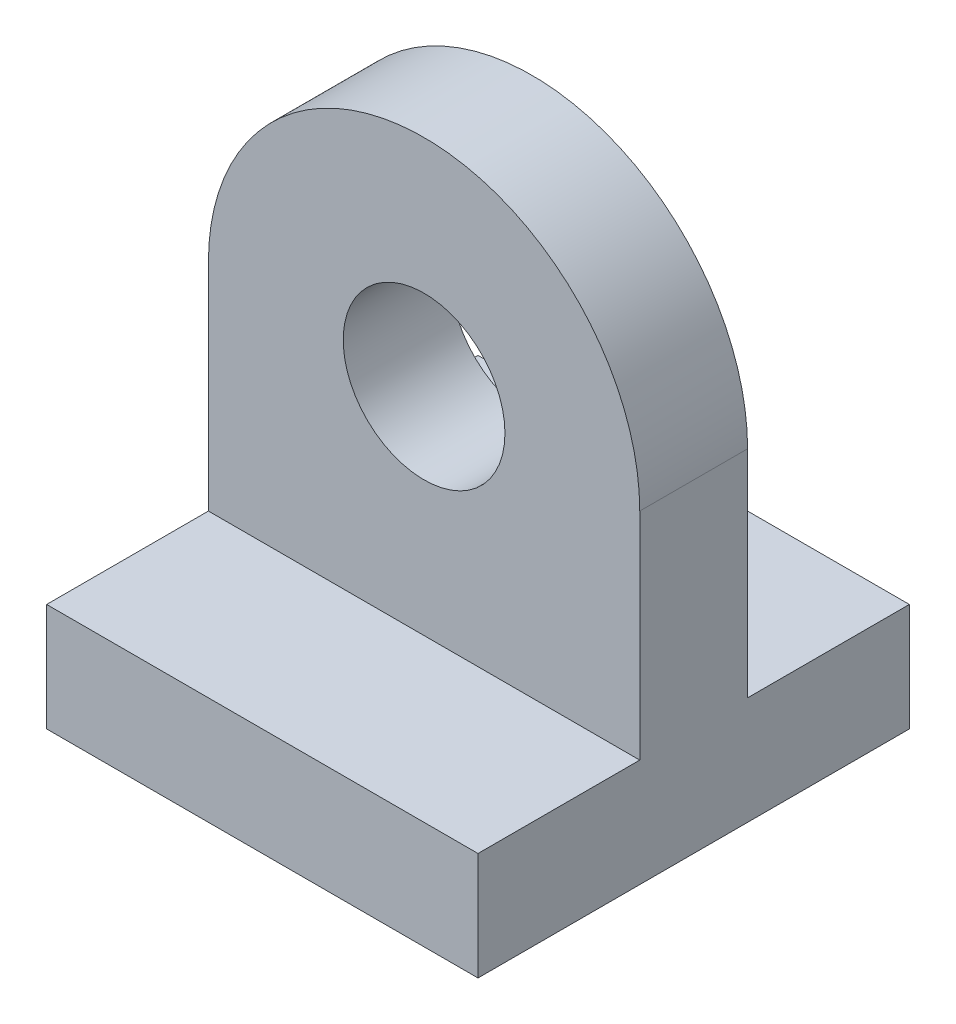
ISO-10303-21;
HEADER;
FILE_DESCRIPTION(('STEP AP214'),'2;1');
FILE_NAME('part.step','',(''),(''),'','','');
FILE_SCHEMA(('AUTOMOTIVE_DESIGN { 1 0 10303 214 1 1 1 1 }'));
ENDSEC;
DATA;
#1=APPLICATION_CONTEXT('core data for automotive mechanical design processes');
#2=APPLICATION_PROTOCOL_DEFINITION('international standard','automotive_design',2000,#1);
#3=PRODUCT_CONTEXT('',#1,'mechanical');
#4=PRODUCT('Part','Part','',(#3));
#5=PRODUCT_RELATED_PRODUCT_CATEGORY('part','',(#4));
#6=PRODUCT_DEFINITION_FORMATION('','',#4);
#7=PRODUCT_DEFINITION_CONTEXT('part definition',#1,'design');
#8=PRODUCT_DEFINITION('design','',#6,#7);
#9=PRODUCT_DEFINITION_SHAPE('','',#8);
#10=(LENGTH_UNIT() NAMED_UNIT(*) SI_UNIT(.MILLI.,.METRE.));
#11=(NAMED_UNIT(*) PLANE_ANGLE_UNIT() SI_UNIT($,.RADIAN.));
#12=(NAMED_UNIT(*) SI_UNIT($,.STERADIAN.) SOLID_ANGLE_UNIT());
#13=UNCERTAINTY_MEASURE_WITH_UNIT(LENGTH_MEASURE(1.E-05),#10,'distance_accuracy_value','');
#14=(GEOMETRIC_REPRESENTATION_CONTEXT(3) GLOBAL_UNCERTAINTY_ASSIGNED_CONTEXT((#13)) GLOBAL_UNIT_ASSIGNED_CONTEXT((#10,
#11,#12)) REPRESENTATION_CONTEXT('',''));
#15=CARTESIAN_POINT('',(0.,0.,0.));
#16=DIRECTION('',(0.,0.,1.));
#17=DIRECTION('',(1.,0.,0.));
#18=AXIS2_PLACEMENT_3D('',#15,#16,#17);
#19=CARTESIAN_POINT('',(8.,0.,-2.));
#20=DIRECTION('',(1.,0.,0.));
#21=DIRECTION('',(0.,1.,0.));
#22=AXIS2_PLACEMENT_3D('',#19,#20,#21);
#23=PLANE('',#22);
#24=DIRECTION('',(0.,1.,0.));
#25=VECTOR('',#24,1.);
#26=CARTESIAN_POINT('',(8.,0.,2.));
#27=LINE('',#26,#25);
#28=CARTESIAN_POINT('',(8.,-8.,2.));
#29=VERTEX_POINT('',#28);
#30=CARTESIAN_POINT('',(8.,0.,2.));
#31=VERTEX_POINT('',#30);
#32=EDGE_CURVE('E166',#29,#31,#27,.T.);
#33=ORIENTED_EDGE('',*,*,#32,.F.);
#34=DIRECTION('',(0.,0.,1.));
#35=VECTOR('',#34,1.);
#36=CARTESIAN_POINT('',(8.00000000000001,-8.,-8.));
#37=LINE('',#36,#35);
#38=CARTESIAN_POINT('',(8.00000000000001,-8.,8.));
#39=VERTEX_POINT('',#38);
#40=EDGE_CURVE('E149',#29,#39,#37,.T.);
#41=ORIENTED_EDGE('',*,*,#40,.T.);
#42=DIRECTION('',(0.,1.,0.));
#43=VECTOR('',#42,1.);
#44=CARTESIAN_POINT('',(8.,-12.,8.));
#45=LINE('',#44,#43);
#46=CARTESIAN_POINT('',(8.,-12.,8.));
#47=VERTEX_POINT('',#46);
#48=EDGE_CURVE('E123',#47,#39,#45,.T.);
#49=ORIENTED_EDGE('',*,*,#48,.F.);
#50=DIRECTION('',(0.,0.,1.));
#51=VECTOR('',#50,1.);
#52=CARTESIAN_POINT('',(8.,-12.,-2.));
#53=LINE('',#52,#51);
#54=CARTESIAN_POINT('',(8.,-12.,-8.));
#55=VERTEX_POINT('',#54);
#56=EDGE_CURVE('E47',#55,#47,#53,.T.);
#57=ORIENTED_EDGE('',*,*,#56,.F.);
#58=DIRECTION('',(0.,1.,0.));
#59=VECTOR('',#58,1.);
#60=CARTESIAN_POINT('',(8.,-12.,-8.));
#61=LINE('',#60,#59);
#62=CARTESIAN_POINT('',(8.00000000000001,-8.,-8.));
#63=VERTEX_POINT('',#62);
#64=EDGE_CURVE('E141',#55,#63,#61,.T.);
#65=ORIENTED_EDGE('',*,*,#64,.T.);
#66=CARTESIAN_POINT('',(8.00000000000001,-8.,-2.));
#67=VERTEX_POINT('',#66);
#68=EDGE_CURVE('E155',#63,#67,#37,.T.);
#69=ORIENTED_EDGE('',*,*,#68,.T.);
#70=DIRECTION('',(0.,1.,0.));
#71=VECTOR('',#70,1.);
#72=CARTESIAN_POINT('',(8.,0.,-2.));
#73=LINE('',#72,#71);
#74=CARTESIAN_POINT('',(8.,0.,-2.));
#75=VERTEX_POINT('',#74);
#76=EDGE_CURVE('E178',#67,#75,#73,.T.);
#77=ORIENTED_EDGE('',*,*,#76,.T.);
#78=DIRECTION('',(0.,0.,1.));
#79=VECTOR('',#78,1.);
#80=CARTESIAN_POINT('',(8.,0.,-2.));
#81=LINE('',#80,#79);
#82=EDGE_CURVE('E188',#75,#31,#81,.T.);
#83=ORIENTED_EDGE('',*,*,#82,.T.);
#84=EDGE_LOOP('',(#33,#41,#49,#57,#65,#69,#77,#83));
#85=FACE_BOUND('',#84,.T.);
#86=ADVANCED_FACE('F39',(#85),#23,.T.);
#87=CARTESIAN_POINT('',(-8.,-12.,-2.));
#88=DIRECTION('',(0.,-1.,0.));
#89=DIRECTION('',(0.,0.,-1.));
#90=AXIS2_PLACEMENT_3D('',#87,#88,#89);
#91=PLANE('',#90);
#92=ORIENTED_EDGE('',*,*,#56,.T.);
#93=DIRECTION('',(1.,0.,0.));
#94=VECTOR('',#93,1.);
#95=CARTESIAN_POINT('',(-8.,-12.,8.));
#96=LINE('',#95,#94);
#97=CARTESIAN_POINT('',(-8.,-12.,8.));
#98=VERTEX_POINT('',#97);
#99=EDGE_CURVE('E117',#98,#47,#96,.T.);
#100=ORIENTED_EDGE('',*,*,#99,.F.);
#101=DIRECTION('',(0.,0.,1.));
#102=VECTOR('',#101,1.);
#103=CARTESIAN_POINT('',(-8.,-12.,-2.));
#104=LINE('',#103,#102);
#105=CARTESIAN_POINT('',(-8.,-12.,-8.));
#106=VERTEX_POINT('',#105);
#107=EDGE_CURVE('E101',#106,#98,#104,.T.);
#108=ORIENTED_EDGE('',*,*,#107,.F.);
#109=DIRECTION('',(1.,0.,0.));
#110=VECTOR('',#109,1.);
#111=CARTESIAN_POINT('',(-8.,-12.,-8.));
#112=LINE('',#111,#110);
#113=EDGE_CURVE('E138',#106,#55,#112,.T.);
#114=ORIENTED_EDGE('',*,*,#113,.T.);
#115=EDGE_LOOP('',(#92,#100,#108,#114));
#116=FACE_BOUND('',#115,.T.);
#117=ADVANCED_FACE('F118',(#116),#91,.T.);
#118=CARTESIAN_POINT('',(-8.,0.,-2.));
#119=DIRECTION('',(-1.,0.,0.));
#120=DIRECTION('',(0.,-1.,0.));
#121=AXIS2_PLACEMENT_3D('',#118,#119,#120);
#122=PLANE('',#121);
#123=DIRECTION('',(0.,-1.,0.));
#124=VECTOR('',#123,1.);
#125=CARTESIAN_POINT('',(-8.,0.,-2.));
#126=LINE('',#125,#124);
#127=CARTESIAN_POINT('',(-8.,0.,-2.));
#128=VERTEX_POINT('',#127);
#129=CARTESIAN_POINT('',(-8.,-8.,-2.));
#130=VERTEX_POINT('',#129);
#131=EDGE_CURVE('E185',#128,#130,#126,.T.);
#132=ORIENTED_EDGE('',*,*,#131,.T.);
#133=DIRECTION('',(0.,0.,1.));
#134=VECTOR('',#133,1.);
#135=CARTESIAN_POINT('',(-8.,-8.,-8.));
#136=LINE('',#135,#134);
#137=CARTESIAN_POINT('',(-8.,-8.,-8.));
#138=VERTEX_POINT('',#137);
#139=EDGE_CURVE('E150',#138,#130,#136,.T.);
#140=ORIENTED_EDGE('',*,*,#139,.F.);
#141=DIRECTION('',(0.,-1.,0.));
#142=VECTOR('',#141,1.);
#143=CARTESIAN_POINT('',(-8.,-12.,-8.));
#144=LINE('',#143,#142);
#145=EDGE_CURVE('E109',#138,#106,#144,.T.);
#146=ORIENTED_EDGE('',*,*,#145,.T.);
#147=ORIENTED_EDGE('',*,*,#107,.T.);
#148=DIRECTION('',(0.,-1.,0.));
#149=VECTOR('',#148,1.);
#150=CARTESIAN_POINT('',(-8.,-12.,8.));
#151=LINE('',#150,#149);
#152=CARTESIAN_POINT('',(-8.,-8.,8.));
#153=VERTEX_POINT('',#152);
#154=EDGE_CURVE('E107',#153,#98,#151,.T.);
#155=ORIENTED_EDGE('',*,*,#154,.F.);
#156=CARTESIAN_POINT('',(-8.,-8.,2.));
#157=VERTEX_POINT('',#156);
#158=EDGE_CURVE('E154',#157,#153,#136,.T.);
#159=ORIENTED_EDGE('',*,*,#158,.F.);
#160=DIRECTION('',(0.,-1.,0.));
#161=VECTOR('',#160,1.);
#162=CARTESIAN_POINT('',(-8.,0.,2.));
#163=LINE('',#162,#161);
#164=CARTESIAN_POINT('',(-8.,0.,2.));
#165=VERTEX_POINT('',#164);
#166=EDGE_CURVE('E54',#165,#157,#163,.T.);
#167=ORIENTED_EDGE('',*,*,#166,.F.);
#168=DIRECTION('',(0.,0.,1.));
#169=VECTOR('',#168,1.);
#170=CARTESIAN_POINT('',(-8.,0.,-2.));
#171=LINE('',#170,#169);
#172=EDGE_CURVE('E114',#128,#165,#171,.T.);
#173=ORIENTED_EDGE('',*,*,#172,.F.);
#174=EDGE_LOOP('',(#132,#140,#146,#147,#155,#159,#167,#173));
#175=FACE_BOUND('',#174,.T.);
#176=ADVANCED_FACE('F104',(#175),#122,.T.);
#177=CARTESIAN_POINT('',(0.,0.,-2.));
#178=DIRECTION('',(0.,0.,1.));
#179=DIRECTION('',(1.,0.,0.));
#180=AXIS2_PLACEMENT_3D('',#177,#178,#179);
#181=CYLINDRICAL_SURFACE('',#180,8.);
#182=ORIENTED_EDGE('',*,*,#172,.T.);
#183=CARTESIAN_POINT('',(0.,0.,2.));
#184=DIRECTION('',(0.,0.,1.));
#185=DIRECTION('',(1.,0.,0.));
#186=AXIS2_PLACEMENT_3D('',#183,#184,#185);
#187=CIRCLE('',#186,8.);
#188=EDGE_CURVE('E169',#31,#165,#187,.T.);
#189=ORIENTED_EDGE('',*,*,#188,.F.);
#190=ORIENTED_EDGE('',*,*,#82,.F.);
#191=CARTESIAN_POINT('',(0.,0.,-2.));
#192=DIRECTION('',(0.,0.,1.));
#193=DIRECTION('',(1.,0.,0.));
#194=AXIS2_PLACEMENT_3D('',#191,#192,#193);
#195=CIRCLE('',#194,8.);
#196=EDGE_CURVE('E181',#75,#128,#195,.T.);
#197=ORIENTED_EDGE('',*,*,#196,.T.);
#198=EDGE_LOOP('',(#182,#189,#190,#197));
#199=FACE_BOUND('',#198,.T.);
#200=ADVANCED_FACE('F201',(#199),#181,.T.);
#201=CARTESIAN_POINT('',(0.,0.,-2.));
#202=DIRECTION('',(0.,0.,1.));
#203=DIRECTION('',(1.,0.,0.));
#204=AXIS2_PLACEMENT_3D('',#201,#202,#203);
#205=PLANE('',#204);
#206=CARTESIAN_POINT('',(0.,0.,-2.));
#207=DIRECTION('',(0.,0.,1.));
#208=DIRECTION('',(1.,0.,0.));
#209=AXIS2_PLACEMENT_3D('',#206,#207,#208);
#210=CIRCLE('',#209,3.);
#211=CARTESIAN_POINT('',(3.,0.,-2.));
#212=VERTEX_POINT('',#211);
#213=EDGE_CURVE('E174',#212,#212,#210,.T.);
#214=ORIENTED_EDGE('',*,*,#213,.T.);
#215=EDGE_LOOP('',(#214));
#216=FACE_BOUND('',#215,.T.);
#217=ORIENTED_EDGE('',*,*,#76,.F.);
#218=DIRECTION('',(-1.,0.,0.));
#219=VECTOR('',#218,1.);
#220=CARTESIAN_POINT('',(0.,-8.,-2.));
#221=LINE('',#220,#219);
#222=EDGE_CURVE('E153',#67,#130,#221,.T.);
#223=ORIENTED_EDGE('',*,*,#222,.T.);
#224=ORIENTED_EDGE('',*,*,#131,.F.);
#225=ORIENTED_EDGE('',*,*,#196,.F.);
#226=EDGE_LOOP('',(#217,#223,#224,#225));
#227=FACE_BOUND('',#226,.T.);
#228=ADVANCED_FACE('F231',(#216,#227),#205,.F.);
#229=CARTESIAN_POINT('',(0.,0.,-2.));
#230=DIRECTION('',(0.,0.,1.));
#231=DIRECTION('',(1.,0.,0.));
#232=AXIS2_PLACEMENT_3D('',#229,#230,#231);
#233=CYLINDRICAL_SURFACE('',#232,3.);
#234=ORIENTED_EDGE('',*,*,#213,.F.);
#235=EDGE_LOOP('',(#234));
#236=FACE_BOUND('',#235,.T.);
#237=CARTESIAN_POINT('',(0.,0.,2.));
#238=DIRECTION('',(0.,0.,1.));
#239=DIRECTION('',(1.,0.,0.));
#240=AXIS2_PLACEMENT_3D('',#237,#238,#239);
#241=CIRCLE('',#240,3.);
#242=CARTESIAN_POINT('',(3.,0.,2.));
#243=VERTEX_POINT('',#242);
#244=EDGE_CURVE('E162',#243,#243,#241,.T.);
#245=ORIENTED_EDGE('',*,*,#244,.T.);
#246=EDGE_LOOP('',(#245));
#247=FACE_BOUND('',#246,.T.);
#248=ADVANCED_FACE('F237',(#236,#247),#233,.F.);
#249=CARTESIAN_POINT('',(0.,0.,2.));
#250=DIRECTION('',(0.,0.,1.));
#251=DIRECTION('',(1.,0.,0.));
#252=AXIS2_PLACEMENT_3D('',#249,#250,#251);
#253=PLANE('',#252);
#254=DIRECTION('',(-1.,0.,0.));
#255=VECTOR('',#254,1.);
#256=CARTESIAN_POINT('',(0.,-8.,2.));
#257=LINE('',#256,#255);
#258=EDGE_CURVE('E11',#29,#157,#257,.T.);
#259=ORIENTED_EDGE('',*,*,#258,.F.);
#260=ORIENTED_EDGE('',*,*,#32,.T.);
#261=ORIENTED_EDGE('',*,*,#188,.T.);
#262=ORIENTED_EDGE('',*,*,#166,.T.);
#263=EDGE_LOOP('',(#259,#260,#261,#262));
#264=FACE_BOUND('',#263,.T.);
#265=ORIENTED_EDGE('',*,*,#244,.F.);
#266=EDGE_LOOP('',(#265));
#267=FACE_BOUND('',#266,.T.);
#268=ADVANCED_FACE('F202',(#264,#267),#253,.T.);
#269=CARTESIAN_POINT('',(0.,0.,8.));
#270=DIRECTION('',(0.,0.,-1.));
#271=DIRECTION('',(-1.,0.,0.));
#272=AXIS2_PLACEMENT_3D('',#269,#270,#271);
#273=PLANE('',#272);
#274=ORIENTED_EDGE('',*,*,#154,.T.);
#275=ORIENTED_EDGE('',*,*,#99,.T.);
#276=ORIENTED_EDGE('',*,*,#48,.T.);
#277=DIRECTION('',(-1.,0.,0.));
#278=VECTOR('',#277,1.);
#279=CARTESIAN_POINT('',(-8.,-8.,8.));
#280=LINE('',#279,#278);
#281=EDGE_CURVE('E128',#39,#153,#280,.T.);
#282=ORIENTED_EDGE('',*,*,#281,.T.);
#283=EDGE_LOOP('',(#274,#275,#276,#282));
#284=FACE_BOUND('',#283,.T.);
#285=ADVANCED_FACE('F126',(#284),#273,.F.);
#286=CARTESIAN_POINT('',(-8.,-8.,-8.));
#287=DIRECTION('',(0.,1.,0.));
#288=DIRECTION('',(0.,0.,1.));
#289=AXIS2_PLACEMENT_3D('',#286,#287,#288);
#290=PLANE('',#289);
#291=ORIENTED_EDGE('',*,*,#40,.F.);
#292=ORIENTED_EDGE('',*,*,#258,.T.);
#293=ORIENTED_EDGE('',*,*,#158,.T.);
#294=ORIENTED_EDGE('',*,*,#281,.F.);
#295=EDGE_LOOP('',(#291,#292,#293,#294));
#296=FACE_BOUND('',#295,.T.);
#297=ADVANCED_FACE('F208',(#296),#290,.T.);
#298=ORIENTED_EDGE('',*,*,#222,.F.);
#299=ORIENTED_EDGE('',*,*,#68,.F.);
#300=DIRECTION('',(-1.,0.,0.));
#301=VECTOR('',#300,1.);
#302=CARTESIAN_POINT('',(-8.,-8.,-8.));
#303=LINE('',#302,#301);
#304=EDGE_CURVE('E145',#63,#138,#303,.T.);
#305=ORIENTED_EDGE('',*,*,#304,.T.);
#306=ORIENTED_EDGE('',*,*,#139,.T.);
#307=EDGE_LOOP('',(#298,#299,#305,#306));
#308=FACE_BOUND('',#307,.T.);
#309=ADVANCED_FACE('F210',(#308),#290,.T.);
#310=CARTESIAN_POINT('',(0.,0.,-8.));
#311=DIRECTION('',(0.,0.,-1.));
#312=DIRECTION('',(-1.,0.,0.));
#313=AXIS2_PLACEMENT_3D('',#310,#311,#312);
#314=PLANE('',#313);
#315=ORIENTED_EDGE('',*,*,#145,.F.);
#316=ORIENTED_EDGE('',*,*,#304,.F.);
#317=ORIENTED_EDGE('',*,*,#64,.F.);
#318=ORIENTED_EDGE('',*,*,#113,.F.);
#319=EDGE_LOOP('',(#315,#316,#317,#318));
#320=FACE_BOUND('',#319,.T.);
#321=ADVANCED_FACE('F216',(#320),#314,.T.);
#322=CLOSED_SHELL('',(#86,#117,#176,#200,#228,#248,#268,#285,#297,#309,#321));
#323=MANIFOLD_SOLID_BREP('B2',#322);
#324=ADVANCED_BREP_SHAPE_REPRESENTATION('',(#18,#323),#14);
#325=SHAPE_DEFINITION_REPRESENTATION(#9,#324);
ENDSEC;
END-ISO-10303-21;
